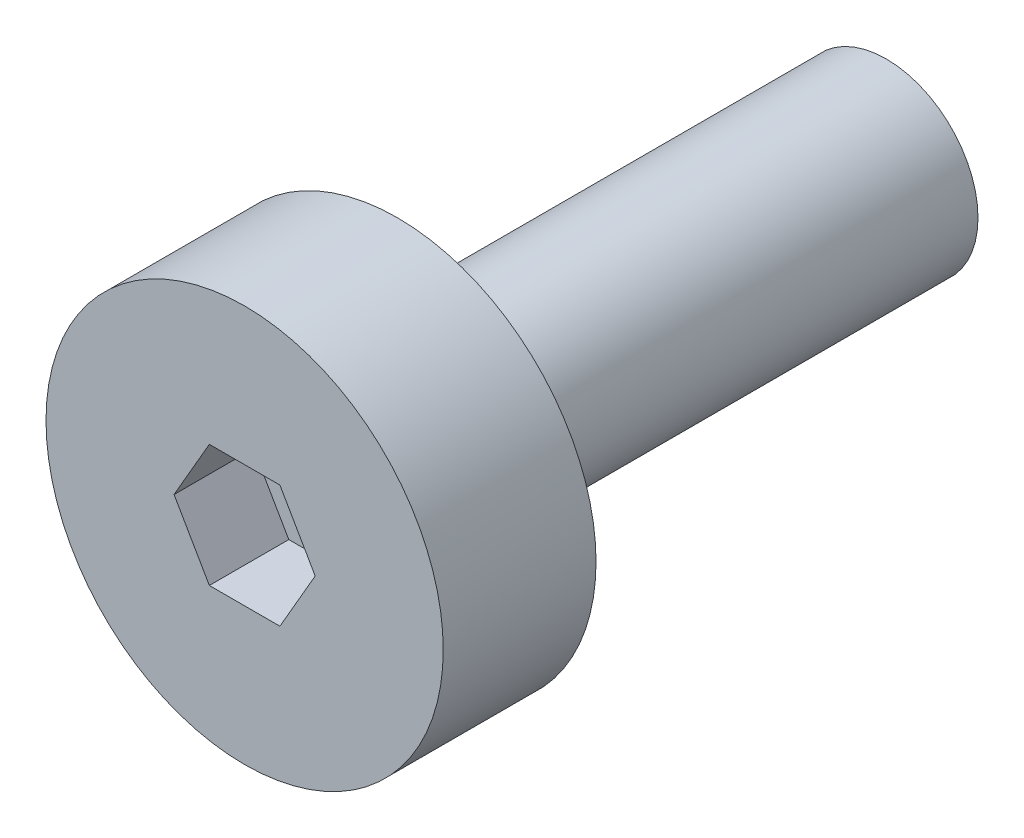
ISO-10303-21;
HEADER;
FILE_DESCRIPTION(('STEP AP214'),'2;1');
FILE_NAME('part.step','',(''),(''),'','','');
FILE_SCHEMA(('AUTOMOTIVE_DESIGN { 1 0 10303 214 1 1 1 1 }'));
ENDSEC;
DATA;
#1=APPLICATION_CONTEXT('core data for automotive mechanical design processes');
#2=APPLICATION_PROTOCOL_DEFINITION('international standard','automotive_design',2000,#1);
#3=PRODUCT_CONTEXT('',#1,'mechanical');
#4=PRODUCT('Part','Part','',(#3));
#5=PRODUCT_RELATED_PRODUCT_CATEGORY('part','',(#4));
#6=PRODUCT_DEFINITION_FORMATION('','',#4);
#7=PRODUCT_DEFINITION_CONTEXT('part definition',#1,'design');
#8=PRODUCT_DEFINITION('design','',#6,#7);
#9=PRODUCT_DEFINITION_SHAPE('','',#8);
#10=(LENGTH_UNIT() NAMED_UNIT(*) SI_UNIT(.MILLI.,.METRE.));
#11=(NAMED_UNIT(*) PLANE_ANGLE_UNIT() SI_UNIT($,.RADIAN.));
#12=(NAMED_UNIT(*) SI_UNIT($,.STERADIAN.) SOLID_ANGLE_UNIT());
#13=UNCERTAINTY_MEASURE_WITH_UNIT(LENGTH_MEASURE(1.E-05),#10,'distance_accuracy_value','');
#14=(GEOMETRIC_REPRESENTATION_CONTEXT(3) GLOBAL_UNCERTAINTY_ASSIGNED_CONTEXT((#13)) GLOBAL_UNIT_ASSIGNED_CONTEXT((#10,
#11,#12)) REPRESENTATION_CONTEXT('',''));
#15=CARTESIAN_POINT('',(0.,0.,0.));
#16=DIRECTION('',(0.,0.,1.));
#17=DIRECTION('',(1.,0.,0.));
#18=AXIS2_PLACEMENT_3D('',#15,#16,#17);
#19=CARTESIAN_POINT('',(0.,0.,1.2));
#20=DIRECTION('',(0.,0.,1.));
#21=DIRECTION('',(1.,0.,0.));
#22=AXIS2_PLACEMENT_3D('',#19,#20,#21);
#23=PLANE('',#22);
#24=DIRECTION('',(-0.50000000000019,0.866025403784329,0.));
#25=VECTOR('',#24,1.);
#26=CARTESIAN_POINT('',(1.154700538379,0.,1.2));
#27=LINE('',#26,#25);
#28=CARTESIAN_POINT('',(1.154700538379,0.,1.2));
#29=VERTEX_POINT('',#28);
#30=CARTESIAN_POINT('',(0.57735026919,1.,1.2));
#31=VERTEX_POINT('',#30);
#32=EDGE_CURVE('E9',#29,#31,#27,.T.);
#33=ORIENTED_EDGE('',*,*,#32,.T.);
#34=DIRECTION('',(-1.,0.,0.));
#35=VECTOR('',#34,1.);
#36=CARTESIAN_POINT('',(0.57735026919,1.,1.2));
#37=LINE('',#36,#35);
#38=CARTESIAN_POINT('',(-0.57735026919,1.,1.2));
#39=VERTEX_POINT('',#38);
#40=EDGE_CURVE('E106',#31,#39,#37,.T.);
#41=ORIENTED_EDGE('',*,*,#40,.T.);
#42=DIRECTION('',(-0.50000000000019,-0.866025403784329,0.));
#43=VECTOR('',#42,1.);
#44=CARTESIAN_POINT('',(-0.57735026919,1.,1.2));
#45=LINE('',#44,#43);
#46=CARTESIAN_POINT('',(-1.154700538379,0.,1.2));
#47=VERTEX_POINT('',#46);
#48=EDGE_CURVE('E101',#39,#47,#45,.T.);
#49=ORIENTED_EDGE('',*,*,#48,.T.);
#50=DIRECTION('',(0.50000000000019,-0.866025403784329,0.));
#51=VECTOR('',#50,1.);
#52=CARTESIAN_POINT('',(-1.154700538379,0.,1.2));
#53=LINE('',#52,#51);
#54=CARTESIAN_POINT('',(-0.57735026919,-1.,1.2));
#55=VERTEX_POINT('',#54);
#56=EDGE_CURVE('E103',#47,#55,#53,.T.);
#57=ORIENTED_EDGE('',*,*,#56,.T.);
#58=DIRECTION('',(1.,0.,0.));
#59=VECTOR('',#58,1.);
#60=CARTESIAN_POINT('',(-0.57735026919,-1.,1.2));
#61=LINE('',#60,#59);
#62=CARTESIAN_POINT('',(0.57735026919,-1.,1.2));
#63=VERTEX_POINT('',#62);
#64=EDGE_CURVE('E125',#55,#63,#61,.T.);
#65=ORIENTED_EDGE('',*,*,#64,.T.);
#66=DIRECTION('',(0.50000000000019,0.866025403784329,0.));
#67=VECTOR('',#66,1.);
#68=CARTESIAN_POINT('',(0.57735026919,-1.,1.2));
#69=LINE('',#68,#67);
#70=EDGE_CURVE('E129',#63,#29,#69,.T.);
#71=ORIENTED_EDGE('',*,*,#70,.T.);
#72=EDGE_LOOP('',(#33,#41,#49,#57,#65,#71));
#73=FACE_BOUND('',#72,.T.);
#74=ADVANCED_FACE('F14',(#73),#23,.T.);
#75=CARTESIAN_POINT('',(0.,0.,-8.));
#76=DIRECTION('',(0.,0.,-1.));
#77=DIRECTION('',(0.,-1.,0.));
#78=AXIS2_PLACEMENT_3D('',#75,#76,#77);
#79=PLANE('',#78);
#80=CARTESIAN_POINT('',(0.,0.,-8.));
#81=DIRECTION('',(0.,0.,-1.));
#82=DIRECTION('',(-1.,0.,0.));
#83=AXIS2_PLACEMENT_3D('',#80,#81,#82);
#84=CIRCLE('',#83,1.5);
#85=CARTESIAN_POINT('',(-1.5,0.,-8.));
#86=VERTEX_POINT('',#85);
#87=EDGE_CURVE('E157',#86,#86,#84,.T.);
#88=ORIENTED_EDGE('',*,*,#87,.T.);
#89=EDGE_LOOP('',(#88));
#90=FACE_BOUND('',#89,.T.);
#91=ADVANCED_FACE('F236',(#90),#79,.T.);
#92=CARTESIAN_POINT('',(1.154700538379,0.,1.2));
#93=DIRECTION('',(-0.866025403784329,-0.50000000000019,0.));
#94=DIRECTION('',(-0.50000000000019,0.866025403784329,0.));
#95=AXIS2_PLACEMENT_3D('',#92,#93,#94);
#96=PLANE('',#95);
#97=ORIENTED_EDGE('',*,*,#32,.F.);
#98=DIRECTION('',(0.,0.,1.));
#99=VECTOR('',#98,1.);
#100=CARTESIAN_POINT('',(1.154700538379,0.,1.2));
#101=LINE('',#100,#99);
#102=CARTESIAN_POINT('',(1.154700538379,0.,2.5));
#103=VERTEX_POINT('',#102);
#104=EDGE_CURVE('E131',#29,#103,#101,.T.);
#105=ORIENTED_EDGE('',*,*,#104,.T.);
#106=DIRECTION('',(-0.50000000000019,0.866025403784329,0.));
#107=VECTOR('',#106,1.);
#108=CARTESIAN_POINT('',(1.010362971082,0.25,2.5));
#109=LINE('',#108,#107);
#110=CARTESIAN_POINT('',(0.57735026919,1.,2.5));
#111=VERTEX_POINT('',#110);
#112=EDGE_CURVE('E135',#103,#111,#109,.T.);
#113=ORIENTED_EDGE('',*,*,#112,.T.);
#114=DIRECTION('',(0.,0.,1.));
#115=VECTOR('',#114,1.);
#116=CARTESIAN_POINT('',(0.57735026919,1.,1.2));
#117=LINE('',#116,#115);
#118=EDGE_CURVE('E25',#31,#111,#117,.T.);
#119=ORIENTED_EDGE('',*,*,#118,.F.);
#120=EDGE_LOOP('',(#97,#105,#113,#119));
#121=FACE_BOUND('',#120,.T.);
#122=ADVANCED_FACE('F16',(#121),#96,.T.);
#123=CARTESIAN_POINT('',(0.57735026919,1.,1.2));
#124=DIRECTION('',(0.,-1.,0.));
#125=DIRECTION('',(-1.,0.,0.));
#126=AXIS2_PLACEMENT_3D('',#123,#124,#125);
#127=PLANE('',#126);
#128=ORIENTED_EDGE('',*,*,#40,.F.);
#129=ORIENTED_EDGE('',*,*,#118,.T.);
#130=DIRECTION('',(-1.,0.,0.));
#131=VECTOR('',#130,1.);
#132=CARTESIAN_POINT('',(0.288675134595,1.,2.5));
#133=LINE('',#132,#131);
#134=CARTESIAN_POINT('',(-0.57735026919,1.,2.5));
#135=VERTEX_POINT('',#134);
#136=EDGE_CURVE('E139',#111,#135,#133,.T.);
#137=ORIENTED_EDGE('',*,*,#136,.T.);
#138=DIRECTION('',(0.,0.,1.));
#139=VECTOR('',#138,1.);
#140=CARTESIAN_POINT('',(-0.57735026919,1.,1.2));
#141=LINE('',#140,#139);
#142=EDGE_CURVE('E18',#39,#135,#141,.T.);
#143=ORIENTED_EDGE('',*,*,#142,.F.);
#144=EDGE_LOOP('',(#128,#129,#137,#143));
#145=FACE_BOUND('',#144,.T.);
#146=ADVANCED_FACE('F200',(#145),#127,.T.);
#147=CARTESIAN_POINT('',(-0.57735026919,1.,1.2));
#148=DIRECTION('',(0.866025403784329,-0.50000000000019,0.));
#149=DIRECTION('',(0.,0.,-1.));
#150=AXIS2_PLACEMENT_3D('',#147,#148,#149);
#151=PLANE('',#150);
#152=ORIENTED_EDGE('',*,*,#48,.F.);
#153=ORIENTED_EDGE('',*,*,#142,.T.);
#154=DIRECTION('',(-0.50000000000019,-0.866025403784329,0.));
#155=VECTOR('',#154,1.);
#156=CARTESIAN_POINT('',(-0.721687836487,0.75,2.5));
#157=LINE('',#156,#155);
#158=CARTESIAN_POINT('',(-1.154700538379,0.,2.5));
#159=VERTEX_POINT('',#158);
#160=EDGE_CURVE('E111',#135,#159,#157,.T.);
#161=ORIENTED_EDGE('',*,*,#160,.T.);
#162=DIRECTION('',(0.,0.,1.));
#163=VECTOR('',#162,1.);
#164=CARTESIAN_POINT('',(-1.154700538379,0.,1.2));
#165=LINE('',#164,#163);
#166=EDGE_CURVE('E79',#47,#159,#165,.T.);
#167=ORIENTED_EDGE('',*,*,#166,.F.);
#168=EDGE_LOOP('',(#152,#153,#161,#167));
#169=FACE_BOUND('',#168,.T.);
#170=ADVANCED_FACE('F109',(#169),#151,.T.);
#171=CARTESIAN_POINT('',(-1.154700538379,0.,1.2));
#172=DIRECTION('',(0.866025403784329,0.50000000000019,0.));
#173=DIRECTION('',(0.,0.,-1.));
#174=AXIS2_PLACEMENT_3D('',#171,#172,#173);
#175=PLANE('',#174);
#176=ORIENTED_EDGE('',*,*,#56,.F.);
#177=ORIENTED_EDGE('',*,*,#166,.T.);
#178=DIRECTION('',(0.50000000000019,-0.866025403784329,0.));
#179=VECTOR('',#178,1.);
#180=CARTESIAN_POINT('',(-1.010362971082,-0.25,2.5));
#181=LINE('',#180,#179);
#182=CARTESIAN_POINT('',(-0.57735026919,-1.,2.5));
#183=VERTEX_POINT('',#182);
#184=EDGE_CURVE('E164',#159,#183,#181,.T.);
#185=ORIENTED_EDGE('',*,*,#184,.T.);
#186=DIRECTION('',(0.,0.,1.));
#187=VECTOR('',#186,1.);
#188=CARTESIAN_POINT('',(-0.57735026919,-1.,1.2));
#189=LINE('',#188,#187);
#190=EDGE_CURVE('E117',#55,#183,#189,.T.);
#191=ORIENTED_EDGE('',*,*,#190,.F.);
#192=EDGE_LOOP('',(#176,#177,#185,#191));
#193=FACE_BOUND('',#192,.T.);
#194=ADVANCED_FACE('F115',(#193),#175,.T.);
#195=CARTESIAN_POINT('',(-0.57735026919,-1.,1.2));
#196=DIRECTION('',(0.,1.,0.));
#197=DIRECTION('',(1.,0.,0.));
#198=AXIS2_PLACEMENT_3D('',#195,#196,#197);
#199=PLANE('',#198);
#200=ORIENTED_EDGE('',*,*,#64,.F.);
#201=ORIENTED_EDGE('',*,*,#190,.T.);
#202=DIRECTION('',(1.,0.,0.));
#203=VECTOR('',#202,1.);
#204=CARTESIAN_POINT('',(-0.288675134595,-1.,2.5));
#205=LINE('',#204,#203);
#206=CARTESIAN_POINT('',(0.57735026919,-1.,2.5));
#207=VERTEX_POINT('',#206);
#208=EDGE_CURVE('E166',#183,#207,#205,.T.);
#209=ORIENTED_EDGE('',*,*,#208,.T.);
#210=DIRECTION('',(0.,0.,1.));
#211=VECTOR('',#210,1.);
#212=CARTESIAN_POINT('',(0.57735026919,-1.,1.2));
#213=LINE('',#212,#211);
#214=EDGE_CURVE('E134',#63,#207,#213,.T.);
#215=ORIENTED_EDGE('',*,*,#214,.F.);
#216=EDGE_LOOP('',(#200,#201,#209,#215));
#217=FACE_BOUND('',#216,.T.);
#218=ADVANCED_FACE('F186',(#217),#199,.T.);
#219=CARTESIAN_POINT('',(0.57735026919,-1.,1.2));
#220=DIRECTION('',(-0.866025403784329,0.50000000000019,0.));
#221=DIRECTION('',(0.,0.,1.));
#222=AXIS2_PLACEMENT_3D('',#219,#220,#221);
#223=PLANE('',#222);
#224=ORIENTED_EDGE('',*,*,#70,.F.);
#225=ORIENTED_EDGE('',*,*,#214,.T.);
#226=DIRECTION('',(0.50000000000019,0.866025403784329,0.));
#227=VECTOR('',#226,1.);
#228=CARTESIAN_POINT('',(0.721687836487,-0.75,2.5));
#229=LINE('',#228,#227);
#230=EDGE_CURVE('E138',#207,#103,#229,.T.);
#231=ORIENTED_EDGE('',*,*,#230,.T.);
#232=ORIENTED_EDGE('',*,*,#104,.F.);
#233=EDGE_LOOP('',(#224,#225,#231,#232));
#234=FACE_BOUND('',#233,.T.);
#235=ADVANCED_FACE('F190',(#234),#223,.T.);
#236=CARTESIAN_POINT('',(0.,0.,0.));
#237=DIRECTION('',(0.,0.,-1.));
#238=DIRECTION('',(-1.,0.,0.));
#239=AXIS2_PLACEMENT_3D('',#236,#237,#238);
#240=CYLINDRICAL_SURFACE('',#239,1.5);
#241=ORIENTED_EDGE('',*,*,#87,.F.);
#242=DIRECTION('',(0.,0.,-1.));
#243=VECTOR('',#242,1.);
#244=CARTESIAN_POINT('',(-1.5,0.,0.));
#245=LINE('',#244,#243);
#246=CARTESIAN_POINT('',(-1.5,0.,0.));
#247=VERTEX_POINT('',#246);
#248=EDGE_CURVE('E162',#247,#86,#245,.T.);
#249=ORIENTED_EDGE('',*,*,#248,.F.);
#250=CARTESIAN_POINT('',(0.,0.,0.));
#251=DIRECTION('',(0.,0.,-1.));
#252=DIRECTION('',(-1.,0.,0.));
#253=AXIS2_PLACEMENT_3D('',#250,#251,#252);
#254=CIRCLE('',#253,1.5);
#255=EDGE_CURVE('E148',#247,#247,#254,.T.);
#256=ORIENTED_EDGE('',*,*,#255,.T.);
#257=ORIENTED_EDGE('',*,*,#248,.T.);
#258=EDGE_LOOP('',(#241,#249,#256,#257));
#259=FACE_BOUND('',#258,.T.);
#260=ADVANCED_FACE('F210',(#259),#240,.T.);
#261=CARTESIAN_POINT('',(0.,0.,2.5));
#262=DIRECTION('',(0.,0.,-1.));
#263=DIRECTION('',(0.,-1.,0.));
#264=AXIS2_PLACEMENT_3D('',#261,#262,#263);
#265=PLANE('',#264);
#266=ORIENTED_EDGE('',*,*,#208,.F.);
#267=ORIENTED_EDGE('',*,*,#184,.F.);
#268=ORIENTED_EDGE('',*,*,#160,.F.);
#269=ORIENTED_EDGE('',*,*,#136,.F.);
#270=ORIENTED_EDGE('',*,*,#112,.F.);
#271=ORIENTED_EDGE('',*,*,#230,.F.);
#272=EDGE_LOOP('',(#266,#267,#268,#269,#270,#271));
#273=FACE_BOUND('',#272,.T.);
#274=CARTESIAN_POINT('',(0.,0.,2.5));
#275=DIRECTION('',(0.,0.,-1.));
#276=DIRECTION('',(-1.,0.,0.));
#277=AXIS2_PLACEMENT_3D('',#274,#275,#276);
#278=CIRCLE('',#277,3.25);
#279=CARTESIAN_POINT('',(-3.25,0.,2.5));
#280=VERTEX_POINT('',#279);
#281=EDGE_CURVE('E144',#280,#280,#278,.T.);
#282=ORIENTED_EDGE('',*,*,#281,.F.);
#283=EDGE_LOOP('',(#282));
#284=FACE_BOUND('',#283,.T.);
#285=ADVANCED_FACE('F203',(#273,#284),#265,.F.);
#286=CARTESIAN_POINT('',(0.,0.,0.));
#287=DIRECTION('',(0.,0.,-1.));
#288=DIRECTION('',(0.,-1.,0.));
#289=AXIS2_PLACEMENT_3D('',#286,#287,#288);
#290=PLANE('',#289);
#291=ORIENTED_EDGE('',*,*,#255,.F.);
#292=EDGE_LOOP('',(#291));
#293=FACE_BOUND('',#292,.T.);
#294=CARTESIAN_POINT('',(0.,0.,0.));
#295=DIRECTION('',(0.,0.,-1.));
#296=DIRECTION('',(-1.,0.,0.));
#297=AXIS2_PLACEMENT_3D('',#294,#295,#296);
#298=CIRCLE('',#297,3.25);
#299=CARTESIAN_POINT('',(-3.25,0.,0.));
#300=VERTEX_POINT('',#299);
#301=EDGE_CURVE('E145',#300,#300,#298,.T.);
#302=ORIENTED_EDGE('',*,*,#301,.T.);
#303=EDGE_LOOP('',(#302));
#304=FACE_BOUND('',#303,.T.);
#305=ADVANCED_FACE('F209',(#293,#304),#290,.T.);
#306=CARTESIAN_POINT('',(0.,0.,2.5));
#307=DIRECTION('',(0.,0.,-1.));
#308=DIRECTION('',(-1.,0.,0.));
#309=AXIS2_PLACEMENT_3D('',#306,#307,#308);
#310=CYLINDRICAL_SURFACE('',#309,3.25);
#311=ORIENTED_EDGE('',*,*,#301,.F.);
#312=DIRECTION('',(0.,0.,-1.));
#313=VECTOR('',#312,1.);
#314=CARTESIAN_POINT('',(-3.25,0.,2.5));
#315=LINE('',#314,#313);
#316=EDGE_CURVE('E141',#280,#300,#315,.T.);
#317=ORIENTED_EDGE('',*,*,#316,.F.);
#318=ORIENTED_EDGE('',*,*,#281,.T.);
#319=ORIENTED_EDGE('',*,*,#316,.T.);
#320=EDGE_LOOP('',(#311,#317,#318,#319));
#321=FACE_BOUND('',#320,.T.);
#322=ADVANCED_FACE('F221',(#321),#310,.T.);
#323=CLOSED_SHELL('',(#74,#91,#122,#146,#170,#194,#218,#235,#260,#285,#305,#322));
#324=MANIFOLD_SOLID_BREP('B1',#323);
#325=ADVANCED_BREP_SHAPE_REPRESENTATION('',(#18,#324),#14);
#326=SHAPE_DEFINITION_REPRESENTATION(#9,#325);
ENDSEC;
END-ISO-10303-21;
